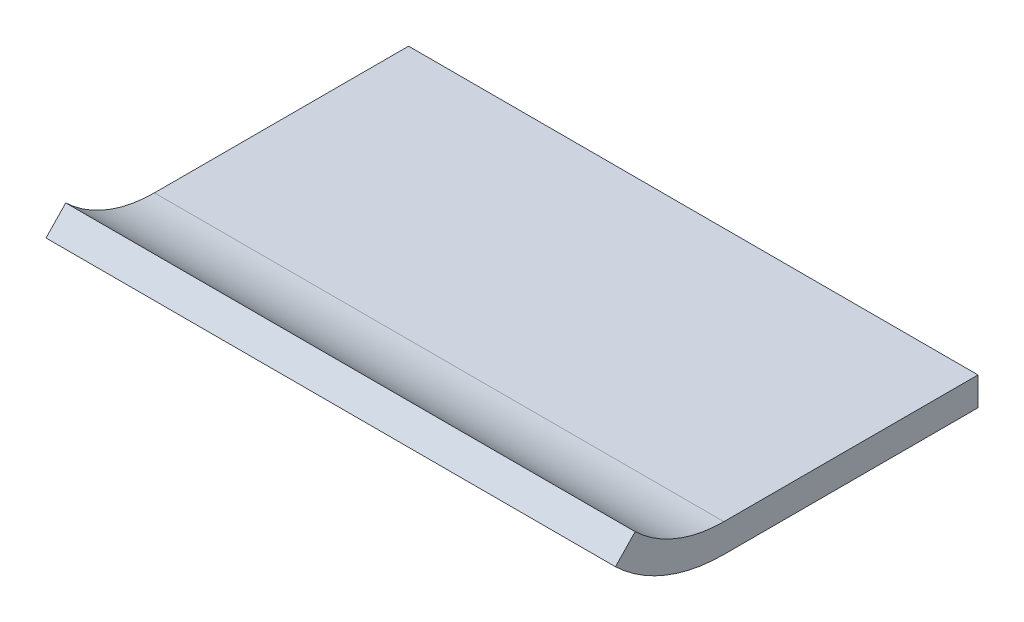
ISO-10303-21;
HEADER;
FILE_DESCRIPTION(('STEP AP214'),'2;1');
FILE_NAME('part.step','',(''),(''),'','','');
FILE_SCHEMA(('AUTOMOTIVE_DESIGN { 1 0 10303 214 1 1 1 1 }'));
ENDSEC;
DATA;
#1=APPLICATION_CONTEXT('core data for automotive mechanical design processes');
#2=APPLICATION_PROTOCOL_DEFINITION('international standard','automotive_design',2000,#1);
#3=PRODUCT_CONTEXT('',#1,'mechanical');
#4=PRODUCT('Part','Part','',(#3));
#5=PRODUCT_RELATED_PRODUCT_CATEGORY('part','',(#4));
#6=PRODUCT_DEFINITION_FORMATION('','',#4);
#7=PRODUCT_DEFINITION_CONTEXT('part definition',#1,'design');
#8=PRODUCT_DEFINITION('design','',#6,#7);
#9=PRODUCT_DEFINITION_SHAPE('','',#8);
#10=(LENGTH_UNIT() NAMED_UNIT(*) SI_UNIT(.MILLI.,.METRE.));
#11=(NAMED_UNIT(*) PLANE_ANGLE_UNIT() SI_UNIT($,.RADIAN.));
#12=(NAMED_UNIT(*) SI_UNIT($,.STERADIAN.) SOLID_ANGLE_UNIT());
#13=UNCERTAINTY_MEASURE_WITH_UNIT(LENGTH_MEASURE(1.E-05),#10,'distance_accuracy_value','');
#14=(GEOMETRIC_REPRESENTATION_CONTEXT(3) GLOBAL_UNCERTAINTY_ASSIGNED_CONTEXT((#13)) GLOBAL_UNIT_ASSIGNED_CONTEXT((#10,
#11,#12)) REPRESENTATION_CONTEXT('',''));
#15=CARTESIAN_POINT('',(0.,0.,0.));
#16=DIRECTION('',(0.,0.,1.));
#17=DIRECTION('',(1.,0.,0.));
#18=AXIS2_PLACEMENT_3D('',#15,#16,#17);
#19=CARTESIAN_POINT('',(311.799999523163,167.221688016655,-65.3088609309251));
#20=DIRECTION('',(1.,0.,2.55099060254924E-13));
#21=DIRECTION('',(-2.55099060254924E-13,0.,1.));
#22=AXIS2_PLACEMENT_3D('',#19,#20,#21);
#23=PLANE('',#22);
#24=DIRECTION('',(2.55099080832383E-13,-8.08929722570027E-07,-0.999999999999673));
#25=VECTOR('',#24,1.);
#26=CARTESIAN_POINT('',(311.799999523164,197.000075701008,-72.5217218618529));
#27=LINE('',#26,#25);
#28=CARTESIAN_POINT('',(311.799999523162,197.000082921284,-63.5960075804163));
#29=VERTEX_POINT('',#28);
#30=CARTESIAN_POINT('',(311.799999523164,197.000075701008,-72.5217218618529));
#31=VERTEX_POINT('',#30);
#32=EDGE_CURVE('E11',#29,#31,#27,.T.);
#33=ORIENTED_EDGE('',*,*,#32,.T.);
#34=DIRECTION('',(0.,-1.,0.));
#35=VECTOR('',#34,1.);
#36=CARTESIAN_POINT('',(311.799999523164,196.000075686107,-72.5217218618529));
#37=LINE('',#36,#35);
#38=CARTESIAN_POINT('',(311.799999523164,196.000075686107,-72.5217218618529));
#39=VERTEX_POINT('',#38);
#40=EDGE_CURVE('E80',#31,#39,#37,.T.);
#41=ORIENTED_EDGE('',*,*,#40,.T.);
#42=DIRECTION('',(-2.55099060254924E-13,0.,1.));
#43=VECTOR('',#42,1.);
#44=CARTESIAN_POINT('',(311.799999523164,196.000075686107,-72.5217218618529));
#45=LINE('',#44,#43);
#46=CARTESIAN_POINT('',(311.799999523162,196.000082906383,-63.5960075804163));
#47=VERTEX_POINT('',#46);
#48=EDGE_CURVE('E102',#39,#47,#45,.T.);
#49=ORIENTED_EDGE('',*,*,#48,.T.);
#50=CARTESIAN_POINT('',(311.799999523161,201.500082921284,-63.5960075804164));
#51=DIRECTION('',(-1.,0.,-2.55099060254924E-13));
#52=DIRECTION('',(-1.58251255544519E-13,-0.721601307235467,0.692308856938914));
#53=AXIS2_PLACEMENT_3D('',#50,#51,#52);
#54=CIRCLE('',#53,5.50000001490118);
#55=CARTESIAN_POINT('',(311.799999523161,197.531275720736,-59.7883088569361));
#56=VERTEX_POINT('',#55);
#57=EDGE_CURVE('E117',#47,#56,#54,.T.);
#58=ORIENTED_EDGE('',*,*,#57,.T.);
#59=DIRECTION('',(1.58251255544517E-13,0.721601307235472,-0.692308856938908));
#60=VECTOR('',#59,1.);
#61=CARTESIAN_POINT('',(311.799999523161,198.252877038724,-60.4806177241912));
#62=LINE('',#61,#60);
#63=CARTESIAN_POINT('',(311.799999523161,198.252877038724,-60.4806177241912));
#64=VERTEX_POINT('',#63);
#65=EDGE_CURVE('E134',#56,#64,#62,.T.);
#66=ORIENTED_EDGE('',*,*,#65,.T.);
#67=CARTESIAN_POINT('',(311.799999523161,201.500082921284,-63.5960075804164));
#68=DIRECTION('',(1.,0.,2.55099060254924E-13));
#69=DIRECTION('',(-1.58251255544519E-13,-0.721601307235465,0.692308856938915));
#70=AXIS2_PLACEMENT_3D('',#67,#68,#69);
#71=CIRCLE('',#70,4.5);
#72=EDGE_CURVE('E129',#64,#29,#71,.T.);
#73=ORIENTED_EDGE('',*,*,#72,.T.);
#74=EDGE_LOOP('',(#33,#41,#49,#58,#66,#73));
#75=FACE_BOUND('',#74,.T.);
#76=ADVANCED_FACE('F17',(#75),#23,.F.);
#77=CARTESIAN_POINT('',(331.799999523163,167.221688016655,-65.30886093092));
#78=DIRECTION('',(1.,0.,2.55099060254924E-13));
#79=DIRECTION('',(-2.55099060254924E-13,0.,1.));
#80=AXIS2_PLACEMENT_3D('',#77,#78,#79);
#81=PLANE('',#80);
#82=DIRECTION('',(-2.55099080832383E-13,8.08929722570027E-07,0.999999999999673));
#83=VECTOR('',#82,1.);
#84=CARTESIAN_POINT('',(331.799999523164,197.000075701009,-72.5217218618479));
#85=LINE('',#84,#83);
#86=CARTESIAN_POINT('',(331.799999523164,197.000075701009,-72.5217218618479));
#87=VERTEX_POINT('',#86);
#88=CARTESIAN_POINT('',(331.799999523162,197.000082921284,-63.5960075804112));
#89=VERTEX_POINT('',#88);
#90=EDGE_CURVE('E28',#87,#89,#85,.T.);
#91=ORIENTED_EDGE('',*,*,#90,.T.);
#92=CARTESIAN_POINT('',(331.799999523161,201.500082921284,-63.5960075804113));
#93=DIRECTION('',(1.,0.,2.55099060254924E-13));
#94=DIRECTION('',(-1.58251255544519E-13,-0.721601307235465,0.692308856938915));
#95=AXIS2_PLACEMENT_3D('',#92,#93,#94);
#96=CIRCLE('',#95,4.5);
#97=CARTESIAN_POINT('',(331.799999523161,198.252877038725,-60.4806177241861));
#98=VERTEX_POINT('',#97);
#99=EDGE_CURVE('E130',#98,#89,#96,.T.);
#100=ORIENTED_EDGE('',*,*,#99,.F.);
#101=DIRECTION('',(-1.58251255544517E-13,-0.721601307235472,0.692308856938908));
#102=VECTOR('',#101,1.);
#103=CARTESIAN_POINT('',(331.799999523161,198.252877038725,-60.4806177241861));
#104=LINE('',#103,#102);
#105=CARTESIAN_POINT('',(331.799999523161,197.531275720737,-59.788308856931));
#106=VERTEX_POINT('',#105);
#107=EDGE_CURVE('E143',#98,#106,#104,.T.);
#108=ORIENTED_EDGE('',*,*,#107,.T.);
#109=CARTESIAN_POINT('',(331.799999523161,201.500082921284,-63.5960075804113));
#110=DIRECTION('',(1.,0.,2.55099060254924E-13));
#111=DIRECTION('',(-1.58251255544519E-13,-0.721601307235467,0.692308856938914));
#112=AXIS2_PLACEMENT_3D('',#109,#110,#111);
#113=CIRCLE('',#112,5.50000001490118);
#114=CARTESIAN_POINT('',(331.799999523162,196.000082906383,-63.5960075804112));
#115=VERTEX_POINT('',#114);
#116=EDGE_CURVE('E108',#106,#115,#113,.T.);
#117=ORIENTED_EDGE('',*,*,#116,.T.);
#118=DIRECTION('',(-2.55099060254924E-13,0.,1.));
#119=VECTOR('',#118,1.);
#120=CARTESIAN_POINT('',(331.799999523164,196.000075686108,-72.5217218618479));
#121=LINE('',#120,#119);
#122=CARTESIAN_POINT('',(331.799999523164,196.000075686108,-72.5217218618479));
#123=VERTEX_POINT('',#122);
#124=EDGE_CURVE('E21',#123,#115,#121,.T.);
#125=ORIENTED_EDGE('',*,*,#124,.F.);
#126=DIRECTION('',(0.,1.,0.));
#127=VECTOR('',#126,1.);
#128=CARTESIAN_POINT('',(331.799999523164,196.000075686108,-72.5217218618479));
#129=LINE('',#128,#127);
#130=EDGE_CURVE('E88',#123,#87,#129,.T.);
#131=ORIENTED_EDGE('',*,*,#130,.T.);
#132=EDGE_LOOP('',(#91,#100,#108,#117,#125,#131));
#133=FACE_BOUND('',#132,.T.);
#134=ADVANCED_FACE('F106',(#133),#81,.T.);
#135=CARTESIAN_POINT('',(331.799999523162,197.000082921284,-63.5960075804112));
#136=DIRECTION('',(0.,0.999999999999673,-8.08929722570027E-07));
#137=DIRECTION('',(-1.,0.,3.07428307499563E-08));
#138=AXIS2_PLACEMENT_3D('',#135,#136,#137);
#139=PLANE('',#138);
#140=ORIENTED_EDGE('',*,*,#90,.F.);
#141=DIRECTION('',(-1.,0.,-2.54907206453935E-13));
#142=VECTOR('',#141,1.);
#143=CARTESIAN_POINT('',(331.799999523164,197.000075701009,-72.5217218618479));
#144=LINE('',#143,#142);
#145=EDGE_CURVE('E93',#87,#31,#144,.T.);
#146=ORIENTED_EDGE('',*,*,#145,.T.);
#147=ORIENTED_EDGE('',*,*,#32,.F.);
#148=DIRECTION('',(-1.,0.,-2.54907206453935E-13));
#149=VECTOR('',#148,1.);
#150=CARTESIAN_POINT('',(331.799999523162,197.000082921284,-63.5960075804112));
#151=LINE('',#150,#149);
#152=EDGE_CURVE('E126',#89,#29,#151,.T.);
#153=ORIENTED_EDGE('',*,*,#152,.F.);
#154=EDGE_LOOP('',(#140,#146,#147,#153));
#155=FACE_BOUND('',#154,.T.);
#156=ADVANCED_FACE('F165',(#155),#139,.T.);
#157=CARTESIAN_POINT('',(331.799999523164,197.000075701009,-72.5217218618479));
#158=DIRECTION('',(2.54907206453935E-13,0.,-1.));
#159=DIRECTION('',(0.,-1.,0.));
#160=AXIS2_PLACEMENT_3D('',#157,#158,#159);
#161=PLANE('',#160);
#162=ORIENTED_EDGE('',*,*,#130,.F.);
#163=DIRECTION('',(-1.,0.,-2.54907206453935E-13));
#164=VECTOR('',#163,1.);
#165=CARTESIAN_POINT('',(331.799999523164,196.000075686108,-72.5217218618479));
#166=LINE('',#165,#164);
#167=EDGE_CURVE('E91',#123,#39,#166,.T.);
#168=ORIENTED_EDGE('',*,*,#167,.T.);
#169=ORIENTED_EDGE('',*,*,#40,.F.);
#170=ORIENTED_EDGE('',*,*,#145,.F.);
#171=EDGE_LOOP('',(#162,#168,#169,#170));
#172=FACE_BOUND('',#171,.T.);
#173=ADVANCED_FACE('F90',(#172),#161,.T.);
#174=CARTESIAN_POINT('',(331.799999523164,196.000075686108,-72.5217218618479));
#175=DIRECTION('',(0.,-1.,0.));
#176=DIRECTION('',(0.,0.,-1.));
#177=AXIS2_PLACEMENT_3D('',#174,#175,#176);
#178=PLANE('',#177);
#179=ORIENTED_EDGE('',*,*,#124,.T.);
#180=DIRECTION('',(-1.,0.,-2.54907206453935E-13));
#181=VECTOR('',#180,1.);
#182=CARTESIAN_POINT('',(331.799999523162,196.000082906383,-63.5960075804112));
#183=LINE('',#182,#181);
#184=EDGE_CURVE('E110',#115,#47,#183,.T.);
#185=ORIENTED_EDGE('',*,*,#184,.T.);
#186=ORIENTED_EDGE('',*,*,#48,.F.);
#187=ORIENTED_EDGE('',*,*,#167,.F.);
#188=EDGE_LOOP('',(#179,#185,#186,#187));
#189=FACE_BOUND('',#188,.T.);
#190=ADVANCED_FACE('F99',(#189),#178,.T.);
#191=CARTESIAN_POINT('',(331.799999523161,201.500082921284,-63.5960075804113));
#192=DIRECTION('',(-1.,0.,-2.54907206453935E-13));
#193=DIRECTION('',(-1.58529016881626E-13,-0.721601307235467,0.692308856938914));
#194=AXIS2_PLACEMENT_3D('',#191,#192,#193);
#195=CYLINDRICAL_SURFACE('',#194,5.50000001490118);
#196=ORIENTED_EDGE('',*,*,#116,.F.);
#197=DIRECTION('',(-1.,0.,-2.54907206453935E-13));
#198=VECTOR('',#197,1.);
#199=CARTESIAN_POINT('',(331.799999523161,197.531275720737,-59.788308856931));
#200=LINE('',#199,#198);
#201=EDGE_CURVE('E131',#106,#56,#200,.T.);
#202=ORIENTED_EDGE('',*,*,#201,.T.);
#203=ORIENTED_EDGE('',*,*,#57,.F.);
#204=ORIENTED_EDGE('',*,*,#184,.F.);
#205=EDGE_LOOP('',(#196,#202,#203,#204));
#206=FACE_BOUND('',#205,.T.);
#207=ADVANCED_FACE('F212',(#206),#195,.T.);
#208=CARTESIAN_POINT('',(331.799999523161,197.531275720737,-59.788308856931));
#209=DIRECTION('',(-2.01158399422913E-13,0.692308856938908,0.721601307235472));
#210=DIRECTION('',(1.,2.90561643703865E-13,0.));
#211=AXIS2_PLACEMENT_3D('',#208,#209,#210);
#212=PLANE('',#211);
#213=ORIENTED_EDGE('',*,*,#107,.F.);
#214=DIRECTION('',(-1.,0.,-2.54907206453935E-13));
#215=VECTOR('',#214,1.);
#216=CARTESIAN_POINT('',(331.799999523161,198.252877038725,-60.4806177241861));
#217=LINE('',#216,#215);
#218=EDGE_CURVE('E149',#98,#64,#217,.T.);
#219=ORIENTED_EDGE('',*,*,#218,.T.);
#220=ORIENTED_EDGE('',*,*,#65,.F.);
#221=ORIENTED_EDGE('',*,*,#201,.F.);
#222=EDGE_LOOP('',(#213,#219,#220,#221));
#223=FACE_BOUND('',#222,.T.);
#224=ADVANCED_FACE('F19',(#223),#212,.T.);
#225=CARTESIAN_POINT('',(331.799999523161,201.500082921284,-63.5960075804113));
#226=DIRECTION('',(-1.,0.,-2.54907206453935E-13));
#227=DIRECTION('',(-1.58529016881626E-13,-0.721601307235465,0.692308856938915));
#228=AXIS2_PLACEMENT_3D('',#225,#226,#227);
#229=CYLINDRICAL_SURFACE('',#228,4.5);
#230=ORIENTED_EDGE('',*,*,#99,.T.);
#231=ORIENTED_EDGE('',*,*,#152,.T.);
#232=ORIENTED_EDGE('',*,*,#72,.F.);
#233=ORIENTED_EDGE('',*,*,#218,.F.);
#234=EDGE_LOOP('',(#230,#231,#232,#233));
#235=FACE_BOUND('',#234,.T.);
#236=ADVANCED_FACE('F159',(#235),#229,.F.);
#237=CLOSED_SHELL('',(#76,#134,#156,#173,#190,#207,#224,#236));
#238=MANIFOLD_SOLID_BREP('B1',#237);
#239=ADVANCED_BREP_SHAPE_REPRESENTATION('',(#18,#238),#14);
#240=SHAPE_DEFINITION_REPRESENTATION(#9,#239);
ENDSEC;
END-ISO-10303-21;
